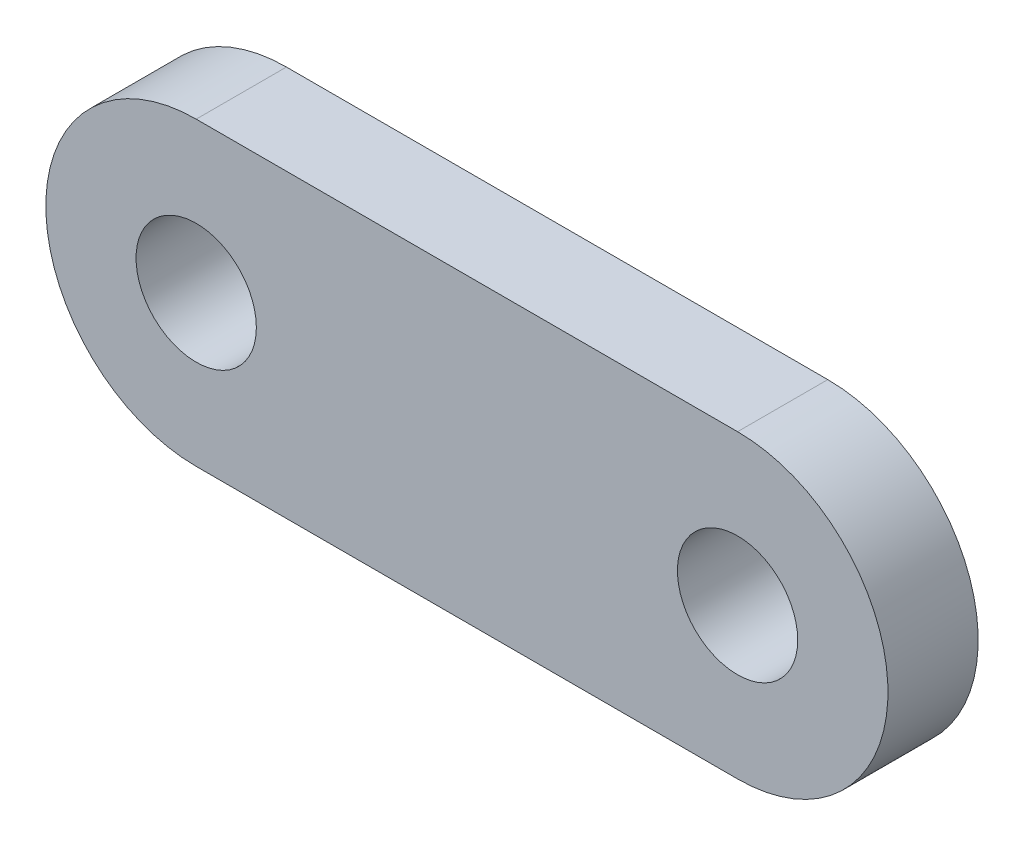
ISO-10303-21;
HEADER;
FILE_DESCRIPTION(('STEP AP214'),'2;1');
FILE_NAME('part.step','',(''),(''),'','','');
FILE_SCHEMA(('AUTOMOTIVE_DESIGN { 1 0 10303 214 1 1 1 1 }'));
ENDSEC;
DATA;
#1=APPLICATION_CONTEXT('core data for automotive mechanical design processes');
#2=APPLICATION_PROTOCOL_DEFINITION('international standard','automotive_design',2000,#1);
#3=PRODUCT_CONTEXT('',#1,'mechanical');
#4=PRODUCT('Part','Part','',(#3));
#5=PRODUCT_RELATED_PRODUCT_CATEGORY('part','',(#4));
#6=PRODUCT_DEFINITION_FORMATION('','',#4);
#7=PRODUCT_DEFINITION_CONTEXT('part definition',#1,'design');
#8=PRODUCT_DEFINITION('design','',#6,#7);
#9=PRODUCT_DEFINITION_SHAPE('','',#8);
#10=(LENGTH_UNIT() NAMED_UNIT(*) SI_UNIT(.MILLI.,.METRE.));
#11=(NAMED_UNIT(*) PLANE_ANGLE_UNIT() SI_UNIT($,.RADIAN.));
#12=(NAMED_UNIT(*) SI_UNIT($,.STERADIAN.) SOLID_ANGLE_UNIT());
#13=UNCERTAINTY_MEASURE_WITH_UNIT(LENGTH_MEASURE(1.E-05),#10,'distance_accuracy_value','');
#14=(GEOMETRIC_REPRESENTATION_CONTEXT(3) GLOBAL_UNCERTAINTY_ASSIGNED_CONTEXT((#13)) GLOBAL_UNIT_ASSIGNED_CONTEXT((#10,
#11,#12)) REPRESENTATION_CONTEXT('',''));
#15=CARTESIAN_POINT('',(0.,0.,0.));
#16=DIRECTION('',(0.,0.,1.));
#17=DIRECTION('',(1.,0.,0.));
#18=AXIS2_PLACEMENT_3D('',#15,#16,#17);
#19=CARTESIAN_POINT('',(-9.,0.,3.));
#20=DIRECTION('',(0.,0.,1.));
#21=DIRECTION('',(1.,0.,0.));
#22=AXIS2_PLACEMENT_3D('',#19,#20,#21);
#23=PLANE('',#22);
#24=CARTESIAN_POINT('',(-9.,0.,3.));
#25=DIRECTION('',(0.,0.,1.));
#26=DIRECTION('',(1.,0.,0.));
#27=AXIS2_PLACEMENT_3D('',#24,#25,#26);
#28=CIRCLE('',#27,2.);
#29=CARTESIAN_POINT('',(-7.,0.,3.));
#30=VERTEX_POINT('',#29);
#31=EDGE_CURVE('E106',#30,#30,#28,.T.);
#32=ORIENTED_EDGE('',*,*,#31,.F.);
#33=EDGE_LOOP('',(#32));
#34=FACE_BOUND('',#33,.T.);
#35=CARTESIAN_POINT('',(-9.,0.,3.));
#36=DIRECTION('',(0.,0.,1.));
#37=DIRECTION('',(1.,0.,0.));
#38=AXIS2_PLACEMENT_3D('',#35,#36,#37);
#39=CIRCLE('',#38,5.);
#40=CARTESIAN_POINT('',(-9.,5.,3.));
#41=VERTEX_POINT('',#40);
#42=CARTESIAN_POINT('',(-9.,-5.,3.));
#43=VERTEX_POINT('',#42);
#44=EDGE_CURVE('E91',#41,#43,#39,.T.);
#45=ORIENTED_EDGE('',*,*,#44,.T.);
#46=DIRECTION('',(1.,0.,0.));
#47=VECTOR('',#46,1.);
#48=CARTESIAN_POINT('',(-9.,-5.,3.));
#49=LINE('',#48,#47);
#50=CARTESIAN_POINT('',(9.00000000000001,-5.,3.));
#51=VERTEX_POINT('',#50);
#52=EDGE_CURVE('E86',#43,#51,#49,.T.);
#53=ORIENTED_EDGE('',*,*,#52,.T.);
#54=CARTESIAN_POINT('',(9.,0.,3.));
#55=DIRECTION('',(0.,0.,1.));
#56=DIRECTION('',(1.,0.,0.));
#57=AXIS2_PLACEMENT_3D('',#54,#55,#56);
#58=CIRCLE('',#57,5.);
#59=CARTESIAN_POINT('',(9.,5.,3.));
#60=VERTEX_POINT('',#59);
#61=EDGE_CURVE('E89',#51,#60,#58,.T.);
#62=ORIENTED_EDGE('',*,*,#61,.T.);
#63=DIRECTION('',(-1.,0.,0.));
#64=VECTOR('',#63,1.);
#65=CARTESIAN_POINT('',(-9.,5.,3.));
#66=LINE('',#65,#64);
#67=EDGE_CURVE('E56',#60,#41,#66,.T.);
#68=ORIENTED_EDGE('',*,*,#67,.T.);
#69=EDGE_LOOP('',(#45,#53,#62,#68));
#70=FACE_BOUND('',#69,.T.);
#71=CARTESIAN_POINT('',(9.,0.,3.));
#72=DIRECTION('',(0.,0.,1.));
#73=DIRECTION('',(1.,0.,0.));
#74=AXIS2_PLACEMENT_3D('',#71,#72,#73);
#75=CIRCLE('',#74,2.);
#76=CARTESIAN_POINT('',(11.,0.,3.));
#77=VERTEX_POINT('',#76);
#78=EDGE_CURVE('E121',#77,#77,#75,.T.);
#79=ORIENTED_EDGE('',*,*,#78,.F.);
#80=EDGE_LOOP('',(#79));
#81=FACE_BOUND('',#80,.T.);
#82=ADVANCED_FACE('F39',(#34,#70,#81),#23,.T.);
#83=CARTESIAN_POINT('',(-9.,0.,0.));
#84=DIRECTION('',(0.,0.,1.));
#85=DIRECTION('',(1.,0.,0.));
#86=AXIS2_PLACEMENT_3D('',#83,#84,#85);
#87=PLANE('',#86);
#88=CARTESIAN_POINT('',(-9.,0.,0.));
#89=DIRECTION('',(0.,0.,1.));
#90=DIRECTION('',(1.,0.,0.));
#91=AXIS2_PLACEMENT_3D('',#88,#89,#90);
#92=CIRCLE('',#91,5.);
#93=CARTESIAN_POINT('',(-9.,5.,0.));
#94=VERTEX_POINT('',#93);
#95=CARTESIAN_POINT('',(-9.,-5.,0.));
#96=VERTEX_POINT('',#95);
#97=EDGE_CURVE('E103',#94,#96,#92,.T.);
#98=ORIENTED_EDGE('',*,*,#97,.F.);
#99=DIRECTION('',(-1.,0.,0.));
#100=VECTOR('',#99,1.);
#101=CARTESIAN_POINT('',(-9.,5.,0.));
#102=LINE('',#101,#100);
#103=CARTESIAN_POINT('',(9.,5.,0.));
#104=VERTEX_POINT('',#103);
#105=EDGE_CURVE('E79',#104,#94,#102,.T.);
#106=ORIENTED_EDGE('',*,*,#105,.F.);
#107=CARTESIAN_POINT('',(9.,0.,0.));
#108=DIRECTION('',(0.,0.,1.));
#109=DIRECTION('',(1.,0.,0.));
#110=AXIS2_PLACEMENT_3D('',#107,#108,#109);
#111=CIRCLE('',#110,5.);
#112=CARTESIAN_POINT('',(9.00000000000001,-5.,0.));
#113=VERTEX_POINT('',#112);
#114=EDGE_CURVE('E73',#113,#104,#111,.T.);
#115=ORIENTED_EDGE('',*,*,#114,.F.);
#116=DIRECTION('',(1.,0.,0.));
#117=VECTOR('',#116,1.);
#118=CARTESIAN_POINT('',(-9.,-5.,0.));
#119=LINE('',#118,#117);
#120=EDGE_CURVE('E95',#96,#113,#119,.T.);
#121=ORIENTED_EDGE('',*,*,#120,.F.);
#122=EDGE_LOOP('',(#98,#106,#115,#121));
#123=FACE_BOUND('',#122,.T.);
#124=CARTESIAN_POINT('',(-9.,0.,0.));
#125=DIRECTION('',(0.,0.,1.));
#126=DIRECTION('',(1.,0.,0.));
#127=AXIS2_PLACEMENT_3D('',#124,#125,#126);
#128=CIRCLE('',#127,2.);
#129=CARTESIAN_POINT('',(-7.,0.,0.));
#130=VERTEX_POINT('',#129);
#131=EDGE_CURVE('E118',#130,#130,#128,.T.);
#132=ORIENTED_EDGE('',*,*,#131,.T.);
#133=EDGE_LOOP('',(#132));
#134=FACE_BOUND('',#133,.T.);
#135=CARTESIAN_POINT('',(9.,0.,0.));
#136=DIRECTION('',(0.,0.,1.));
#137=DIRECTION('',(1.,0.,0.));
#138=AXIS2_PLACEMENT_3D('',#135,#136,#137);
#139=CIRCLE('',#138,2.);
#140=CARTESIAN_POINT('',(11.,0.,0.));
#141=VERTEX_POINT('',#140);
#142=EDGE_CURVE('E124',#141,#141,#139,.T.);
#143=ORIENTED_EDGE('',*,*,#142,.T.);
#144=EDGE_LOOP('',(#143));
#145=FACE_BOUND('',#144,.T.);
#146=ADVANCED_FACE('F114',(#123,#134,#145),#87,.F.);
#147=CARTESIAN_POINT('',(-9.,0.,3.));
#148=DIRECTION('',(0.,0.,-1.));
#149=DIRECTION('',(-1.,0.,0.));
#150=AXIS2_PLACEMENT_3D('',#147,#148,#149);
#151=CYLINDRICAL_SURFACE('',#150,5.);
#152=ORIENTED_EDGE('',*,*,#97,.T.);
#153=DIRECTION('',(0.,0.,-1.));
#154=VECTOR('',#153,1.);
#155=CARTESIAN_POINT('',(-9.,-5.,3.));
#156=LINE('',#155,#154);
#157=EDGE_CURVE('E11',#43,#96,#156,.T.);
#158=ORIENTED_EDGE('',*,*,#157,.F.);
#159=ORIENTED_EDGE('',*,*,#44,.F.);
#160=DIRECTION('',(0.,0.,-1.));
#161=VECTOR('',#160,1.);
#162=CARTESIAN_POINT('',(-9.,5.,3.));
#163=LINE('',#162,#161);
#164=EDGE_CURVE('E99',#41,#94,#163,.T.);
#165=ORIENTED_EDGE('',*,*,#164,.T.);
#166=EDGE_LOOP('',(#152,#158,#159,#165));
#167=FACE_BOUND('',#166,.T.);
#168=ADVANCED_FACE('F41',(#167),#151,.T.);
#169=CARTESIAN_POINT('',(-9.,-5.,3.));
#170=DIRECTION('',(0.,1.,0.));
#171=DIRECTION('',(-1.,0.,0.));
#172=AXIS2_PLACEMENT_3D('',#169,#170,#171);
#173=PLANE('',#172);
#174=ORIENTED_EDGE('',*,*,#120,.T.);
#175=DIRECTION('',(0.,0.,-1.));
#176=VECTOR('',#175,1.);
#177=CARTESIAN_POINT('',(9.00000000000001,-5.,3.));
#178=LINE('',#177,#176);
#179=EDGE_CURVE('E48',#51,#113,#178,.T.);
#180=ORIENTED_EDGE('',*,*,#179,.F.);
#181=ORIENTED_EDGE('',*,*,#52,.F.);
#182=ORIENTED_EDGE('',*,*,#157,.T.);
#183=EDGE_LOOP('',(#174,#180,#181,#182));
#184=FACE_BOUND('',#183,.T.);
#185=ADVANCED_FACE('F94',(#184),#173,.F.);
#186=CARTESIAN_POINT('',(9.,0.,3.));
#187=DIRECTION('',(0.,0.,-1.));
#188=DIRECTION('',(-1.,0.,0.));
#189=AXIS2_PLACEMENT_3D('',#186,#187,#188);
#190=CYLINDRICAL_SURFACE('',#189,5.);
#191=ORIENTED_EDGE('',*,*,#114,.T.);
#192=DIRECTION('',(0.,0.,-1.));
#193=VECTOR('',#192,1.);
#194=CARTESIAN_POINT('',(9.,5.,3.));
#195=LINE('',#194,#193);
#196=EDGE_CURVE('E96',#60,#104,#195,.T.);
#197=ORIENTED_EDGE('',*,*,#196,.F.);
#198=ORIENTED_EDGE('',*,*,#61,.F.);
#199=ORIENTED_EDGE('',*,*,#179,.T.);
#200=EDGE_LOOP('',(#191,#197,#198,#199));
#201=FACE_BOUND('',#200,.T.);
#202=ADVANCED_FACE('F97',(#201),#190,.T.);
#203=CARTESIAN_POINT('',(-9.,5.,3.));
#204=DIRECTION('',(0.,-1.,0.));
#205=DIRECTION('',(1.,0.,0.));
#206=AXIS2_PLACEMENT_3D('',#203,#204,#205);
#207=PLANE('',#206);
#208=ORIENTED_EDGE('',*,*,#105,.T.);
#209=ORIENTED_EDGE('',*,*,#164,.F.);
#210=ORIENTED_EDGE('',*,*,#67,.F.);
#211=ORIENTED_EDGE('',*,*,#196,.T.);
#212=EDGE_LOOP('',(#208,#209,#210,#211));
#213=FACE_BOUND('',#212,.T.);
#214=ADVANCED_FACE('F111',(#213),#207,.F.);
#215=CARTESIAN_POINT('',(-9.,0.,3.));
#216=DIRECTION('',(0.,0.,-1.));
#217=DIRECTION('',(-1.,0.,0.));
#218=AXIS2_PLACEMENT_3D('',#215,#216,#217);
#219=CYLINDRICAL_SURFACE('',#218,2.);
#220=ORIENTED_EDGE('',*,*,#31,.T.);
#221=EDGE_LOOP('',(#220));
#222=FACE_BOUND('',#221,.T.);
#223=ORIENTED_EDGE('',*,*,#131,.F.);
#224=EDGE_LOOP('',(#223));
#225=FACE_BOUND('',#224,.T.);
#226=ADVANCED_FACE('F141',(#222,#225),#219,.F.);
#227=CARTESIAN_POINT('',(9.,0.,3.));
#228=DIRECTION('',(0.,0.,-1.));
#229=DIRECTION('',(-1.,0.,0.));
#230=AXIS2_PLACEMENT_3D('',#227,#228,#229);
#231=CYLINDRICAL_SURFACE('',#230,2.);
#232=ORIENTED_EDGE('',*,*,#78,.T.);
#233=EDGE_LOOP('',(#232));
#234=FACE_BOUND('',#233,.T.);
#235=ORIENTED_EDGE('',*,*,#142,.F.);
#236=EDGE_LOOP('',(#235));
#237=FACE_BOUND('',#236,.T.);
#238=ADVANCED_FACE('F130',(#234,#237),#231,.F.);
#239=CLOSED_SHELL('',(#82,#146,#168,#185,#202,#214,#226,#238));
#240=MANIFOLD_SOLID_BREP('B2',#239);
#241=ADVANCED_BREP_SHAPE_REPRESENTATION('',(#18,#240),#14);
#242=SHAPE_DEFINITION_REPRESENTATION(#9,#241);
ENDSEC;
END-ISO-10303-21;
